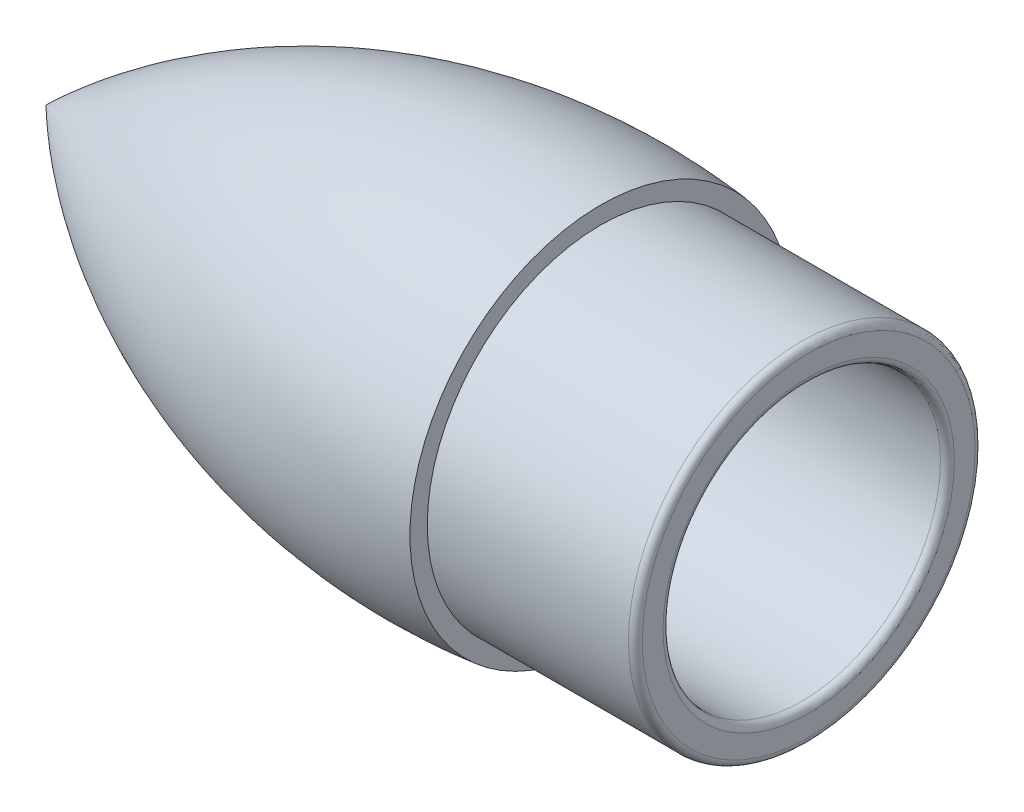
ISO-10303-21;
HEADER;
FILE_DESCRIPTION(('STEP AP214'),'2;1');
FILE_NAME('part.step','',(''),(''),'','','');
FILE_SCHEMA(('AUTOMOTIVE_DESIGN { 1 0 10303 214 1 1 1 1 }'));
ENDSEC;
DATA;
#1=APPLICATION_CONTEXT('core data for automotive mechanical design processes');
#2=APPLICATION_PROTOCOL_DEFINITION('international standard','automotive_design',2000,#1);
#3=PRODUCT_CONTEXT('',#1,'mechanical');
#4=PRODUCT('Part','Part','',(#3));
#5=PRODUCT_RELATED_PRODUCT_CATEGORY('part','',(#4));
#6=PRODUCT_DEFINITION_FORMATION('','',#4);
#7=PRODUCT_DEFINITION_CONTEXT('part definition',#1,'design');
#8=PRODUCT_DEFINITION('design','',#6,#7);
#9=PRODUCT_DEFINITION_SHAPE('','',#8);
#10=(LENGTH_UNIT() NAMED_UNIT(*) SI_UNIT(.MILLI.,.METRE.));
#11=(NAMED_UNIT(*) PLANE_ANGLE_UNIT() SI_UNIT($,.RADIAN.));
#12=(NAMED_UNIT(*) SI_UNIT($,.STERADIAN.) SOLID_ANGLE_UNIT());
#13=UNCERTAINTY_MEASURE_WITH_UNIT(LENGTH_MEASURE(1.E-05),#10,'distance_accuracy_value','');
#14=(GEOMETRIC_REPRESENTATION_CONTEXT(3) GLOBAL_UNCERTAINTY_ASSIGNED_CONTEXT((#13)) GLOBAL_UNIT_ASSIGNED_CONTEXT((#10,
#11,#12)) REPRESENTATION_CONTEXT('',''));
#15=CARTESIAN_POINT('',(0.,0.,0.));
#16=DIRECTION('',(0.,0.,1.));
#17=DIRECTION('',(1.,0.,0.));
#18=AXIS2_PLACEMENT_3D('',#15,#16,#17);
#19=CARTESIAN_POINT('',(14.3209660343519,0.,71.4926655170034));
#20=DIRECTION('',(0.,-1.,0.));
#21=DIRECTION('',(0.,0.,-1.));
#22=AXIS2_PLACEMENT_3D('',#19,#20,#21);
#23=CIRCLE('',#22,99.5670105637443);
#24=TRIMMED_CURVE('',#23,(PARAMETER_VALUE(-0.769820414560979)),
(PARAMETER_VALUE(0.769820414560979)),.T.,.PARAMETER.);
#25=CARTESIAN_POINT('',(14.3209660343519,0.,0.));
#26=DIRECTION('',(1.,0.,0.));
#27=AXIS1_PLACEMENT('',#25,#26);
#28=SURFACE_OF_REVOLUTION('',#24,#27);
#29=CARTESIAN_POINT('',(-54.9783006996811,0.,0.));
#30=VERTEX_POINT('',#29);
#31=VERTEX_LOOP('',#30);
#32=FACE_BOUND('',#31,.T.);
#33=CARTESIAN_POINT('',(25.,0.,0.));
#34=DIRECTION('',(1.,0.,0.));
#35=DIRECTION('',(0.,0.,-1.));
#36=AXIS2_PLACEMENT_3D('',#33,#34,#35);
#37=CIRCLE('',#36,27.5);
#38=CARTESIAN_POINT('',(25.,0.,-27.5));
#39=VERTEX_POINT('',#38);
#40=EDGE_CURVE('E55',#39,#39,#37,.T.);
#41=ORIENTED_EDGE('',*,*,#40,.F.);
#42=EDGE_LOOP('',(#41));
#43=FACE_BOUND('',#42,.T.);
#44=ADVANCED_FACE('F39',(#32,#43),#28,.T.);
#45=CARTESIAN_POINT('',(25.,0.,0.));
#46=DIRECTION('',(1.,0.,0.));
#47=DIRECTION('',(0.,0.,-1.));
#48=AXIS2_PLACEMENT_3D('',#45,#46,#47);
#49=PLANE('',#48);
#50=ORIENTED_EDGE('',*,*,#40,.T.);
#51=EDGE_LOOP('',(#50));
#52=FACE_BOUND('',#51,.T.);
#53=CARTESIAN_POINT('',(25.,0.,0.));
#54=DIRECTION('',(1.,0.,0.));
#55=DIRECTION('',(0.,0.,-1.));
#56=AXIS2_PLACEMENT_3D('',#53,#54,#55);
#57=CIRCLE('',#56,25.);
#58=CARTESIAN_POINT('',(25.,0.,-25.));
#59=VERTEX_POINT('',#58);
#60=EDGE_CURVE('E58',#59,#59,#57,.T.);
#61=ORIENTED_EDGE('',*,*,#60,.F.);
#62=EDGE_LOOP('',(#61));
#63=FACE_BOUND('',#62,.T.);
#64=ADVANCED_FACE('F51',(#52,#63),#49,.T.);
#65=CARTESIAN_POINT('',(55.,0.,0.));
#66=DIRECTION('',(1.,0.,0.));
#67=DIRECTION('',(0.,0.,-1.));
#68=AXIS2_PLACEMENT_3D('',#65,#66,#67);
#69=CYLINDRICAL_SURFACE('',#68,25.);
#70=CARTESIAN_POINT('',(54.,0.,0.));
#71=DIRECTION('',(1.,0.,0.));
#72=DIRECTION('',(0.,0.,-1.));
#73=AXIS2_PLACEMENT_3D('',#70,#71,#72);
#74=CIRCLE('',#73,25.);
#75=CARTESIAN_POINT('',(54.,0.,-25.));
#76=VERTEX_POINT('',#75);
#77=EDGE_CURVE('E46',#76,#76,#74,.F.);
#78=ORIENTED_EDGE('',*,*,#77,.T.);
#79=EDGE_LOOP('',(#78));
#80=FACE_BOUND('',#79,.T.);
#81=ORIENTED_EDGE('',*,*,#60,.T.);
#82=EDGE_LOOP('',(#81));
#83=FACE_BOUND('',#82,.T.);
#84=ADVANCED_FACE('F72',(#80,#83),#69,.T.);
#85=CARTESIAN_POINT('',(55.,0.,0.));
#86=DIRECTION('',(1.,0.,0.));
#87=DIRECTION('',(0.,0.,-1.));
#88=AXIS2_PLACEMENT_3D('',#85,#86,#87);
#89=PLANE('',#88);
#90=CARTESIAN_POINT('',(55.,0.,0.));
#91=DIRECTION('',(1.,0.,0.));
#92=DIRECTION('',(0.,0.,-1.));
#93=AXIS2_PLACEMENT_3D('',#90,#91,#92);
#94=CIRCLE('',#93,24.);
#95=CARTESIAN_POINT('',(55.,0.,-24.));
#96=VERTEX_POINT('',#95);
#97=EDGE_CURVE('E61',#96,#96,#94,.T.);
#98=ORIENTED_EDGE('',*,*,#97,.T.);
#99=EDGE_LOOP('',(#98));
#100=FACE_BOUND('',#99,.T.);
#101=CARTESIAN_POINT('',(55.,0.,0.));
#102=DIRECTION('',(1.,0.,0.));
#103=DIRECTION('',(0.,0.,-1.));
#104=AXIS2_PLACEMENT_3D('',#101,#102,#103);
#105=CIRCLE('',#104,21.);
#106=CARTESIAN_POINT('',(55.,0.,-21.));
#107=VERTEX_POINT('',#106);
#108=EDGE_CURVE('E57',#107,#107,#105,.F.);
#109=ORIENTED_EDGE('',*,*,#108,.T.);
#110=EDGE_LOOP('',(#109));
#111=FACE_BOUND('',#110,.T.);
#112=ADVANCED_FACE('F81',(#100,#111),#89,.T.);
#113=CARTESIAN_POINT('',(55.,0.,0.));
#114=DIRECTION('',(1.,0.,0.));
#115=DIRECTION('',(0.,0.,-1.));
#116=AXIS2_PLACEMENT_3D('',#113,#114,#115);
#117=CYLINDRICAL_SURFACE('',#116,20.);
#118=CARTESIAN_POINT('',(54.,0.,0.));
#119=DIRECTION('',(1.,0.,0.));
#120=DIRECTION('',(0.,0.,-1.));
#121=AXIS2_PLACEMENT_3D('',#118,#119,#120);
#122=CIRCLE('',#121,20.);
#123=CARTESIAN_POINT('',(54.,0.,-20.));
#124=VERTEX_POINT('',#123);
#125=EDGE_CURVE('E11',#124,#124,#122,.T.);
#126=ORIENTED_EDGE('',*,*,#125,.T.);
#127=EDGE_LOOP('',(#126));
#128=FACE_BOUND('',#127,.T.);
#129=CARTESIAN_POINT('',(20.,0.,0.));
#130=DIRECTION('',(1.,0.,0.));
#131=DIRECTION('',(0.,0.,-1.));
#132=AXIS2_PLACEMENT_3D('',#129,#130,#131);
#133=CIRCLE('',#132,20.);
#134=CARTESIAN_POINT('',(20.,0.,-20.));
#135=VERTEX_POINT('',#134);
#136=EDGE_CURVE('E64',#135,#135,#133,.T.);
#137=ORIENTED_EDGE('',*,*,#136,.F.);
#138=EDGE_LOOP('',(#137));
#139=FACE_BOUND('',#138,.T.);
#140=ADVANCED_FACE('F84',(#128,#139),#117,.F.);
#141=CARTESIAN_POINT('',(20.,0.,0.));
#142=DIRECTION('',(-1.,0.,0.));
#143=DIRECTION('',(0.,0.,1.));
#144=AXIS2_PLACEMENT_3D('',#141,#142,#143);
#145=PLANE('',#144);
#146=ORIENTED_EDGE('',*,*,#136,.T.);
#147=EDGE_LOOP('',(#146));
#148=FACE_BOUND('',#147,.T.);
#149=CARTESIAN_POINT('',(20.,0.,0.));
#150=DIRECTION('',(1.,0.,0.));
#151=DIRECTION('',(0.,0.,-1.));
#152=AXIS2_PLACEMENT_3D('',#149,#150,#151);
#153=CIRCLE('',#152,22.5);
#154=CARTESIAN_POINT('',(20.,0.,-22.5));
#155=VERTEX_POINT('',#154);
#156=EDGE_CURVE('E99',#155,#155,#153,.T.);
#157=ORIENTED_EDGE('',*,*,#156,.F.);
#158=EDGE_LOOP('',(#157));
#159=FACE_BOUND('',#158,.T.);
#160=ADVANCED_FACE('F94',(#148,#159),#145,.T.);
#161=CARTESIAN_POINT('',(55.,0.,0.));
#162=DIRECTION('',(1.,0.,0.));
#163=DIRECTION('',(0.,0.,-1.));
#164=AXIS2_PLACEMENT_3D('',#161,#162,#163);
#165=CYLINDRICAL_SURFACE('',#164,22.5);
#166=ORIENTED_EDGE('',*,*,#156,.T.);
#167=EDGE_LOOP('',(#166));
#168=FACE_BOUND('',#167,.T.);
#169=CARTESIAN_POINT('',(25.,0.,0.));
#170=DIRECTION('',(1.,0.,0.));
#171=DIRECTION('',(0.,0.,-1.));
#172=AXIS2_PLACEMENT_3D('',#169,#170,#171);
#173=CIRCLE('',#172,22.5);
#174=CARTESIAN_POINT('',(25.,0.,-22.5));
#175=VERTEX_POINT('',#174);
#176=EDGE_CURVE('E101',#175,#175,#173,.T.);
#177=ORIENTED_EDGE('',*,*,#176,.F.);
#178=EDGE_LOOP('',(#177));
#179=FACE_BOUND('',#178,.T.);
#180=ADVANCED_FACE('F114',(#168,#179),#165,.T.);
#181=CARTESIAN_POINT('',(16.7215997535578,0.,0.));
#182=DIRECTION('',(1.,0.,0.));
#183=DIRECTION('',(0.,0.,-1.));
#184=AXIS2_PLACEMENT_3D('',#181,#182,#183);
#185=DEGENERATE_TOROIDAL_SURFACE('',#184,85.9431995071155,108.758721167456,.F.);
#186=CARTESIAN_POINT('',(-40.,0.,0.));
#187=DIRECTION('',(1.,0.,0.));
#188=DIRECTION('',(0.,0.,-1.));
#189=AXIS2_PLACEMENT_3D('',#186,#187,#188);
#190=CIRCLE('',#189,6.85291868420514);
#191=CARTESIAN_POINT('',(-40.,0.,-6.85291868420513));
#192=VERTEX_POINT('',#191);
#193=EDGE_CURVE('E106',#192,#192,#190,.T.);
#194=ORIENTED_EDGE('',*,*,#193,.F.);
#195=EDGE_LOOP('',(#194));
#196=FACE_BOUND('',#195,.T.);
#197=ORIENTED_EDGE('',*,*,#176,.T.);
#198=EDGE_LOOP('',(#197));
#199=FACE_BOUND('',#198,.T.);
#200=ADVANCED_FACE('F111',(#196,#199),#185,.T.);
#201=CARTESIAN_POINT('',(-40.,0.,0.));
#202=DIRECTION('',(-1.,0.,0.));
#203=DIRECTION('',(0.,0.,1.));
#204=AXIS2_PLACEMENT_3D('',#201,#202,#203);
#205=PLANE('',#204);
#206=ORIENTED_EDGE('',*,*,#193,.T.);
#207=EDGE_LOOP('',(#206));
#208=FACE_BOUND('',#207,.T.);
#209=ADVANCED_FACE('F78',(#208),#205,.F.);
#210=CARTESIAN_POINT('',(54.,0.,0.));
#211=DIRECTION('',(1.,0.,0.));
#212=DIRECTION('',(0.,0.,-1.));
#213=AXIS2_PLACEMENT_3D('',#210,#211,#212);
#214=TOROIDAL_SURFACE('',#213,24.,1.);
#215=ORIENTED_EDGE('',*,*,#77,.F.);
#216=EDGE_LOOP('',(#215));
#217=FACE_BOUND('',#216,.T.);
#218=ORIENTED_EDGE('',*,*,#97,.F.);
#219=EDGE_LOOP('',(#218));
#220=FACE_BOUND('',#219,.T.);
#221=ADVANCED_FACE('F75',(#217,#220),#214,.T.);
#222=CARTESIAN_POINT('',(54.,0.,0.));
#223=DIRECTION('',(1.,0.,0.));
#224=DIRECTION('',(0.,0.,-1.));
#225=AXIS2_PLACEMENT_3D('',#222,#223,#224);
#226=TOROIDAL_SURFACE('',#225,21.,1.);
#227=ORIENTED_EDGE('',*,*,#108,.F.);
#228=EDGE_LOOP('',(#227));
#229=FACE_BOUND('',#228,.T.);
#230=ORIENTED_EDGE('',*,*,#125,.F.);
#231=EDGE_LOOP('',(#230));
#232=FACE_BOUND('',#231,.T.);
#233=ADVANCED_FACE('F41',(#229,#232),#226,.T.);
#234=CLOSED_SHELL('',(#44,#64,#84,#112,#140,#160,#180,#200,#209,#221,#233));
#235=MANIFOLD_SOLID_BREP('B2',#234);
#236=ADVANCED_BREP_SHAPE_REPRESENTATION('',(#18,#235),#14);
#237=SHAPE_DEFINITION_REPRESENTATION(#9,#236);
ENDSEC;
END-ISO-10303-21;
